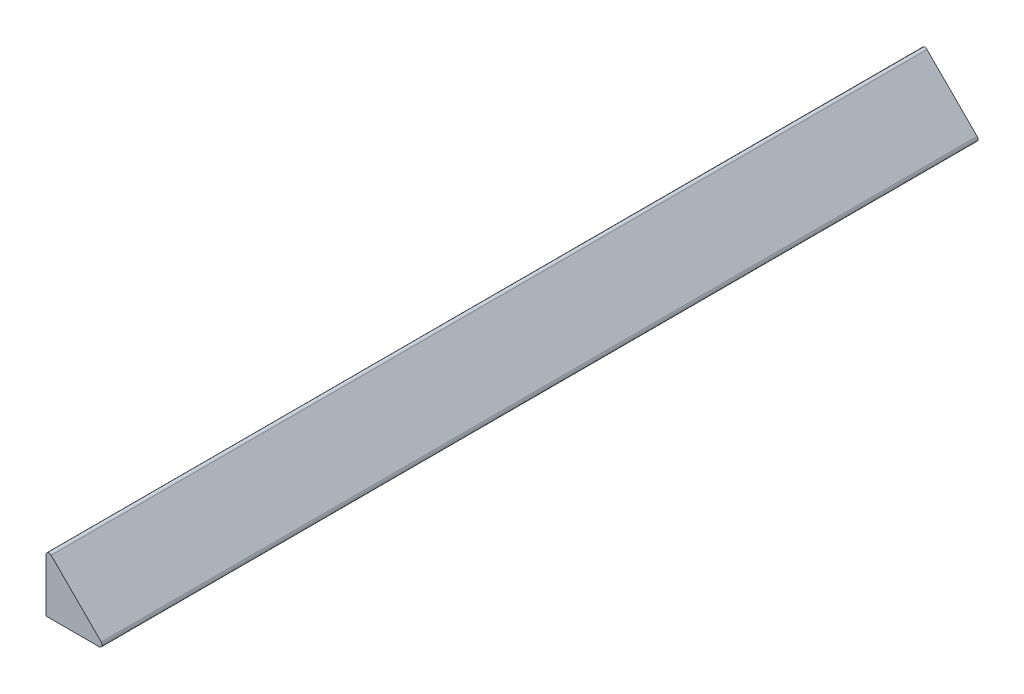
ISO-10303-21;
HEADER;
FILE_DESCRIPTION(('STEP AP214'),'2;1');
FILE_NAME('part.step','',(''),(''),'','','');
FILE_SCHEMA(('AUTOMOTIVE_DESIGN { 1 0 10303 214 1 1 1 1 }'));
ENDSEC;
DATA;
#1=APPLICATION_CONTEXT('core data for automotive mechanical design processes');
#2=APPLICATION_PROTOCOL_DEFINITION('international standard','automotive_design',2000,#1);
#3=PRODUCT_CONTEXT('',#1,'mechanical');
#4=PRODUCT('Part','Part','',(#3));
#5=PRODUCT_RELATED_PRODUCT_CATEGORY('part','',(#4));
#6=PRODUCT_DEFINITION_FORMATION('','',#4);
#7=PRODUCT_DEFINITION_CONTEXT('part definition',#1,'design');
#8=PRODUCT_DEFINITION('design','',#6,#7);
#9=PRODUCT_DEFINITION_SHAPE('','',#8);
#10=(LENGTH_UNIT() NAMED_UNIT(*) SI_UNIT(.MILLI.,.METRE.));
#11=(NAMED_UNIT(*) PLANE_ANGLE_UNIT() SI_UNIT($,.RADIAN.));
#12=(NAMED_UNIT(*) SI_UNIT($,.STERADIAN.) SOLID_ANGLE_UNIT());
#13=UNCERTAINTY_MEASURE_WITH_UNIT(LENGTH_MEASURE(1.E-05),#10,'distance_accuracy_value','');
#14=(GEOMETRIC_REPRESENTATION_CONTEXT(3) GLOBAL_UNCERTAINTY_ASSIGNED_CONTEXT((#13)) GLOBAL_UNIT_ASSIGNED_CONTEXT((#10,
#11,#12)) REPRESENTATION_CONTEXT('',''));
#15=CARTESIAN_POINT('',(0.,0.,0.));
#16=DIRECTION('',(0.,0.,1.));
#17=DIRECTION('',(1.,0.,0.));
#18=AXIS2_PLACEMENT_3D('',#15,#16,#17);
#19=CARTESIAN_POINT('',(20.,0.,-290.));
#20=DIRECTION('',(0.,-1.,0.));
#21=DIRECTION('',(1.,0.,0.));
#22=AXIS2_PLACEMENT_3D('',#19,#20,#21);
#23=PLANE('',#22);
#24=DIRECTION('',(1.,0.,0.));
#25=VECTOR('',#24,1.);
#26=CARTESIAN_POINT('',(20.,0.,-290.));
#27=LINE('',#26,#25);
#28=CARTESIAN_POINT('',(0.,0.,-290.));
#29=VERTEX_POINT('',#28);
#30=CARTESIAN_POINT('',(17.5857864376269,0.,-290.));
#31=VERTEX_POINT('',#30);
#32=EDGE_CURVE('E92',#29,#31,#27,.T.);
#33=ORIENTED_EDGE('',*,*,#32,.T.);
#34=DIRECTION('',(0.,0.,1.));
#35=VECTOR('',#34,1.);
#36=CARTESIAN_POINT('',(17.5857864376269,0.,-290.));
#37=LINE('',#36,#35);
#38=CARTESIAN_POINT('',(17.5857864376269,0.,0.));
#39=VERTEX_POINT('',#38);
#40=EDGE_CURVE('E11',#31,#39,#37,.T.);
#41=ORIENTED_EDGE('',*,*,#40,.T.);
#42=DIRECTION('',(1.,0.,0.));
#43=VECTOR('',#42,1.);
#44=CARTESIAN_POINT('',(20.,0.,0.));
#45=LINE('',#44,#43);
#46=CARTESIAN_POINT('',(0.,0.,0.));
#47=VERTEX_POINT('',#46);
#48=EDGE_CURVE('E95',#47,#39,#45,.T.);
#49=ORIENTED_EDGE('',*,*,#48,.F.);
#50=DIRECTION('',(0.,0.,1.));
#51=VECTOR('',#50,1.);
#52=CARTESIAN_POINT('',(0.,0.,-290.));
#53=LINE('',#52,#51);
#54=EDGE_CURVE('E86',#29,#47,#53,.T.);
#55=ORIENTED_EDGE('',*,*,#54,.F.);
#56=EDGE_LOOP('',(#33,#41,#49,#55));
#57=FACE_BOUND('',#56,.T.);
#58=ADVANCED_FACE('F35',(#57),#23,.T.);
#59=CARTESIAN_POINT('',(0.,0.,-290.));
#60=DIRECTION('',(-1.,0.,0.));
#61=DIRECTION('',(0.,0.,1.));
#62=AXIS2_PLACEMENT_3D('',#59,#60,#61);
#63=PLANE('',#62);
#64=DIRECTION('',(0.,-1.,0.));
#65=VECTOR('',#64,1.);
#66=CARTESIAN_POINT('',(0.,0.,0.));
#67=LINE('',#66,#65);
#68=CARTESIAN_POINT('',(0.,17.5857864376269,0.));
#69=VERTEX_POINT('',#68);
#70=EDGE_CURVE('E99',#69,#47,#67,.T.);
#71=ORIENTED_EDGE('',*,*,#70,.F.);
#72=DIRECTION('',(0.,0.,1.));
#73=VECTOR('',#72,1.);
#74=CARTESIAN_POINT('',(0.,17.5857864376269,-290.));
#75=LINE('',#74,#73);
#76=CARTESIAN_POINT('',(0.,17.5857864376269,-290.));
#77=VERTEX_POINT('',#76);
#78=EDGE_CURVE('E58',#69,#77,#75,.F.);
#79=ORIENTED_EDGE('',*,*,#78,.T.);
#80=DIRECTION('',(0.,-1.,0.));
#81=VECTOR('',#80,1.);
#82=CARTESIAN_POINT('',(0.,0.,-290.));
#83=LINE('',#82,#81);
#84=EDGE_CURVE('E83',#77,#29,#83,.T.);
#85=ORIENTED_EDGE('',*,*,#84,.T.);
#86=ORIENTED_EDGE('',*,*,#54,.T.);
#87=EDGE_LOOP('',(#71,#79,#85,#86));
#88=FACE_BOUND('',#87,.T.);
#89=ADVANCED_FACE('F85',(#88),#63,.T.);
#90=CARTESIAN_POINT('',(0.,20.,-290.));
#91=DIRECTION('',(0.707106781186548,0.707106781186548,0.));
#92=DIRECTION('',(-0.707106781186548,0.707106781186548,0.));
#93=AXIS2_PLACEMENT_3D('',#90,#91,#92);
#94=PLANE('',#93);
#95=DIRECTION('',(-0.707106781186548,0.707106781186548,0.));
#96=VECTOR('',#95,1.);
#97=CARTESIAN_POINT('',(0.,20.,-290.));
#98=LINE('',#97,#96);
#99=CARTESIAN_POINT('',(18.2928932188135,1.70710678118655,-290.));
#100=VERTEX_POINT('',#99);
#101=CARTESIAN_POINT('',(1.70710678118655,18.2928932188135,-290.));
#102=VERTEX_POINT('',#101);
#103=EDGE_CURVE('E89',#100,#102,#98,.T.);
#104=ORIENTED_EDGE('',*,*,#103,.T.);
#105=DIRECTION('',(0.,0.,1.));
#106=VECTOR('',#105,1.);
#107=CARTESIAN_POINT('',(1.70710678118655,18.2928932188135,-290.));
#108=LINE('',#107,#106);
#109=CARTESIAN_POINT('',(1.70710678118655,18.2928932188135,0.));
#110=VERTEX_POINT('',#109);
#111=EDGE_CURVE('E110',#102,#110,#108,.T.);
#112=ORIENTED_EDGE('',*,*,#111,.T.);
#113=DIRECTION('',(-0.707106781186548,0.707106781186548,0.));
#114=VECTOR('',#113,1.);
#115=CARTESIAN_POINT('',(0.,20.,0.));
#116=LINE('',#115,#114);
#117=CARTESIAN_POINT('',(18.2928932188135,1.70710678118655,0.));
#118=VERTEX_POINT('',#117);
#119=EDGE_CURVE('E103',#118,#110,#116,.T.);
#120=ORIENTED_EDGE('',*,*,#119,.F.);
#121=DIRECTION('',(0.,0.,1.));
#122=VECTOR('',#121,1.);
#123=CARTESIAN_POINT('',(18.2928932188135,1.70710678118655,-290.));
#124=LINE('',#123,#122);
#125=EDGE_CURVE('E96',#118,#100,#124,.F.);
#126=ORIENTED_EDGE('',*,*,#125,.T.);
#127=EDGE_LOOP('',(#104,#112,#120,#126));
#128=FACE_BOUND('',#127,.T.);
#129=ADVANCED_FACE('F121',(#128),#94,.T.);
#130=CARTESIAN_POINT('',(0.,0.,-290.));
#131=DIRECTION('',(0.,0.,-1.));
#132=DIRECTION('',(-1.,0.,0.));
#133=AXIS2_PLACEMENT_3D('',#130,#131,#132);
#134=PLANE('',#133);
#135=ORIENTED_EDGE('',*,*,#84,.F.);
#136=CARTESIAN_POINT('',(1.,17.5857864376269,-290.));
#137=DIRECTION('',(0.,0.,-1.));
#138=DIRECTION('',(-1.,0.,0.));
#139=AXIS2_PLACEMENT_3D('',#136,#137,#138);
#140=CIRCLE('',#139,1.);
#141=EDGE_CURVE('E43',#77,#102,#140,.T.);
#142=ORIENTED_EDGE('',*,*,#141,.T.);
#143=ORIENTED_EDGE('',*,*,#103,.F.);
#144=CARTESIAN_POINT('',(17.5857864376269,0.999999999999999,-290.));
#145=DIRECTION('',(0.,0.,-1.));
#146=DIRECTION('',(-1.,0.,0.));
#147=AXIS2_PLACEMENT_3D('',#144,#145,#146);
#148=CIRCLE('',#147,1.);
#149=EDGE_CURVE('E50',#100,#31,#148,.T.);
#150=ORIENTED_EDGE('',*,*,#149,.T.);
#151=ORIENTED_EDGE('',*,*,#32,.F.);
#152=EDGE_LOOP('',(#135,#142,#143,#150,#151));
#153=FACE_BOUND('',#152,.T.);
#154=ADVANCED_FACE('F98',(#153),#134,.T.);
#155=CARTESIAN_POINT('',(0.,0.,0.));
#156=DIRECTION('',(0.,0.,-1.));
#157=DIRECTION('',(-1.,0.,0.));
#158=AXIS2_PLACEMENT_3D('',#155,#156,#157);
#159=PLANE('',#158);
#160=ORIENTED_EDGE('',*,*,#119,.T.);
#161=CARTESIAN_POINT('',(1.,17.5857864376269,0.));
#162=DIRECTION('',(0.,0.,-1.));
#163=DIRECTION('',(-1.,0.,0.));
#164=AXIS2_PLACEMENT_3D('',#161,#162,#163);
#165=CIRCLE('',#164,1.);
#166=EDGE_CURVE('E115',#110,#69,#165,.F.);
#167=ORIENTED_EDGE('',*,*,#166,.T.);
#168=ORIENTED_EDGE('',*,*,#70,.T.);
#169=ORIENTED_EDGE('',*,*,#48,.T.);
#170=CARTESIAN_POINT('',(17.5857864376269,0.999999999999999,0.));
#171=DIRECTION('',(0.,0.,-1.));
#172=DIRECTION('',(-1.,0.,0.));
#173=AXIS2_PLACEMENT_3D('',#170,#171,#172);
#174=CIRCLE('',#173,1.);
#175=EDGE_CURVE('E113',#39,#118,#174,.F.);
#176=ORIENTED_EDGE('',*,*,#175,.T.);
#177=EDGE_LOOP('',(#160,#167,#168,#169,#176));
#178=FACE_BOUND('',#177,.T.);
#179=ADVANCED_FACE('F126',(#178),#159,.F.);
#180=CARTESIAN_POINT('',(1.,17.5857864376269,-290.));
#181=DIRECTION('',(0.,0.,1.));
#182=DIRECTION('',(1.,0.,0.));
#183=AXIS2_PLACEMENT_3D('',#180,#181,#182);
#184=CYLINDRICAL_SURFACE('',#183,1.);
#185=ORIENTED_EDGE('',*,*,#141,.F.);
#186=ORIENTED_EDGE('',*,*,#78,.F.);
#187=ORIENTED_EDGE('',*,*,#166,.F.);
#188=ORIENTED_EDGE('',*,*,#111,.F.);
#189=EDGE_LOOP('',(#185,#186,#187,#188));
#190=FACE_BOUND('',#189,.T.);
#191=ADVANCED_FACE('F124',(#190),#184,.T.);
#192=CARTESIAN_POINT('',(17.5857864376269,0.999999999999999,-290.));
#193=DIRECTION('',(0.,0.,1.));
#194=DIRECTION('',(1.,0.,0.));
#195=AXIS2_PLACEMENT_3D('',#192,#193,#194);
#196=CYLINDRICAL_SURFACE('',#195,1.);
#197=ORIENTED_EDGE('',*,*,#149,.F.);
#198=ORIENTED_EDGE('',*,*,#125,.F.);
#199=ORIENTED_EDGE('',*,*,#175,.F.);
#200=ORIENTED_EDGE('',*,*,#40,.F.);
#201=EDGE_LOOP('',(#197,#198,#199,#200));
#202=FACE_BOUND('',#201,.T.);
#203=ADVANCED_FACE('F37',(#202),#196,.T.);
#204=CLOSED_SHELL('',(#58,#89,#129,#154,#179,#191,#203));
#205=MANIFOLD_SOLID_BREP('B2',#204);
#206=ADVANCED_BREP_SHAPE_REPRESENTATION('',(#18,#205),#14);
#207=SHAPE_DEFINITION_REPRESENTATION(#9,#206);
ENDSEC;
END-ISO-10303-21;
